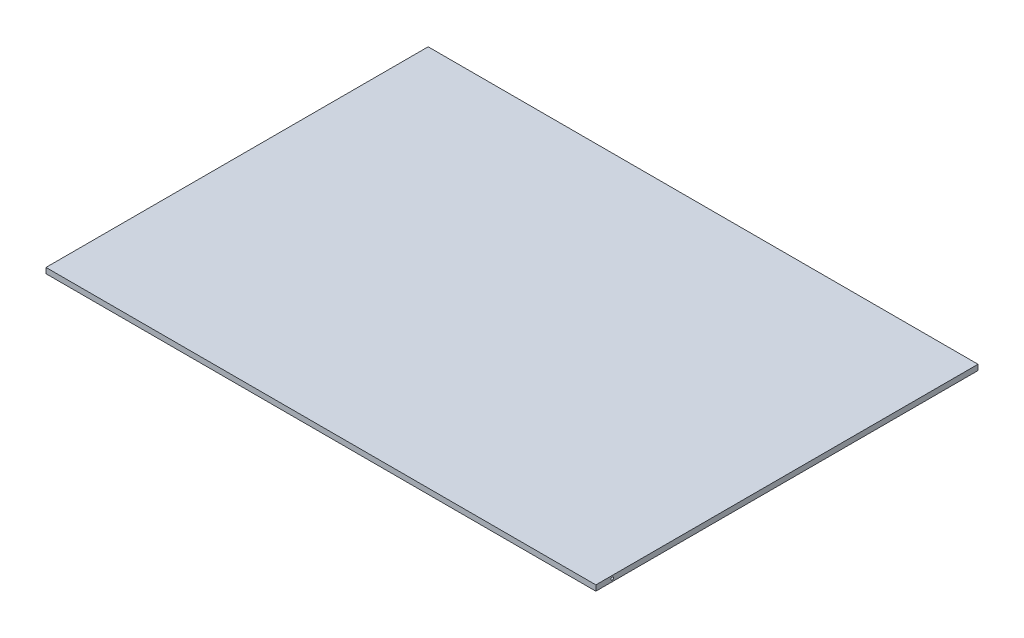
ISO-10303-21;
HEADER;
FILE_DESCRIPTION(('STEP AP214'),'2;1');
FILE_NAME('part.step','',(''),(''),'','','');
FILE_SCHEMA(('AUTOMOTIVE_DESIGN { 1 0 10303 214 1 1 1 1 }'));
ENDSEC;
DATA;
#1=APPLICATION_CONTEXT('core data for automotive mechanical design processes');
#2=APPLICATION_PROTOCOL_DEFINITION('international standard','automotive_design',2000,#1);
#3=PRODUCT_CONTEXT('',#1,'mechanical');
#4=PRODUCT('Part','Part','',(#3));
#5=PRODUCT_RELATED_PRODUCT_CATEGORY('part','',(#4));
#6=PRODUCT_DEFINITION_FORMATION('','',#4);
#7=PRODUCT_DEFINITION_CONTEXT('part definition',#1,'design');
#8=PRODUCT_DEFINITION('design','',#6,#7);
#9=PRODUCT_DEFINITION_SHAPE('','',#8);
#10=(LENGTH_UNIT() NAMED_UNIT(*) SI_UNIT(.MILLI.,.METRE.));
#11=(NAMED_UNIT(*) PLANE_ANGLE_UNIT() SI_UNIT($,.RADIAN.));
#12=(NAMED_UNIT(*) SI_UNIT($,.STERADIAN.) SOLID_ANGLE_UNIT());
#13=UNCERTAINTY_MEASURE_WITH_UNIT(LENGTH_MEASURE(1.E-05),#10,'distance_accuracy_value','');
#14=(GEOMETRIC_REPRESENTATION_CONTEXT(3) GLOBAL_UNCERTAINTY_ASSIGNED_CONTEXT((#13)) GLOBAL_UNIT_ASSIGNED_CONTEXT((#10,
#11,#12)) REPRESENTATION_CONTEXT('',''));
#15=CARTESIAN_POINT('',(0.,0.,0.));
#16=DIRECTION('',(0.,0.,1.));
#17=DIRECTION('',(1.,0.,0.));
#18=AXIS2_PLACEMENT_3D('',#15,#16,#17);
#19=CARTESIAN_POINT('',(-100.,2.,67.));
#20=DIRECTION('',(1.,0.,0.));
#21=DIRECTION('',(0.,0.,-1.));
#22=AXIS2_PLACEMENT_3D('',#19,#20,#21);
#23=PLANE('',#22);
#24=CARTESIAN_POINT('',(-100.,1.,66.));
#25=DIRECTION('',(1.,0.,0.));
#26=DIRECTION('',(0.,0.,-1.));
#27=AXIS2_PLACEMENT_3D('',#24,#25,#26);
#28=CIRCLE('',#27,0.499999999999999);
#29=CARTESIAN_POINT('',(-100.,1.,65.5));
#30=VERTEX_POINT('',#29);
#31=EDGE_CURVE('E88',#30,#30,#28,.T.);
#32=ORIENTED_EDGE('',*,*,#31,.T.);
#33=EDGE_LOOP('',(#32));
#34=FACE_BOUND('',#33,.T.);
#35=DIRECTION('',(0.,0.,1.));
#36=VECTOR('',#35,1.);
#37=CARTESIAN_POINT('',(-100.,0.,67.));
#38=LINE('',#37,#36);
#39=CARTESIAN_POINT('',(-100.,0.,-67.));
#40=VERTEX_POINT('',#39);
#41=CARTESIAN_POINT('',(-100.,0.,72.));
#42=VERTEX_POINT('',#41);
#43=EDGE_CURVE('E82',#40,#42,#38,.T.);
#44=ORIENTED_EDGE('',*,*,#43,.T.);
#45=DIRECTION('',(0.,-1.,0.));
#46=VECTOR('',#45,1.);
#47=CARTESIAN_POINT('',(-100.,0.,72.));
#48=LINE('',#47,#46);
#49=CARTESIAN_POINT('',(-100.,2.,72.));
#50=VERTEX_POINT('',#49);
#51=EDGE_CURVE('E85',#50,#42,#48,.T.);
#52=ORIENTED_EDGE('',*,*,#51,.F.);
#53=DIRECTION('',(0.,0.,1.));
#54=VECTOR('',#53,1.);
#55=CARTESIAN_POINT('',(-100.,2.,67.));
#56=LINE('',#55,#54);
#57=CARTESIAN_POINT('',(-100.,2.,-67.));
#58=VERTEX_POINT('',#57);
#59=EDGE_CURVE('E69',#58,#50,#56,.T.);
#60=ORIENTED_EDGE('',*,*,#59,.F.);
#61=DIRECTION('',(0.,-1.,0.));
#62=VECTOR('',#61,1.);
#63=CARTESIAN_POINT('',(-100.,2.,-67.));
#64=LINE('',#63,#62);
#65=EDGE_CURVE('E45',#58,#40,#64,.T.);
#66=ORIENTED_EDGE('',*,*,#65,.T.);
#67=EDGE_LOOP('',(#44,#52,#60,#66));
#68=FACE_BOUND('',#67,.T.);
#69=ADVANCED_FACE('F37',(#34,#68),#23,.F.);
#70=CARTESIAN_POINT('',(100.,2.,67.));
#71=DIRECTION('',(-1.,0.,0.));
#72=DIRECTION('',(0.,0.,1.));
#73=AXIS2_PLACEMENT_3D('',#70,#71,#72);
#74=PLANE('',#73);
#75=CARTESIAN_POINT('',(100.,1.,66.));
#76=DIRECTION('',(1.,0.,0.));
#77=DIRECTION('',(0.,0.,-1.));
#78=AXIS2_PLACEMENT_3D('',#75,#76,#77);
#79=CIRCLE('',#78,0.499999999999999);
#80=CARTESIAN_POINT('',(100.,1.,65.5));
#81=VERTEX_POINT('',#80);
#82=EDGE_CURVE('E103',#81,#81,#79,.T.);
#83=ORIENTED_EDGE('',*,*,#82,.F.);
#84=EDGE_LOOP('',(#83));
#85=FACE_BOUND('',#84,.T.);
#86=DIRECTION('',(0.,0.,-1.));
#87=VECTOR('',#86,1.);
#88=CARTESIAN_POINT('',(100.,0.,67.));
#89=LINE('',#88,#87);
#90=CARTESIAN_POINT('',(100.,0.,72.));
#91=VERTEX_POINT('',#90);
#92=CARTESIAN_POINT('',(100.,0.,-67.));
#93=VERTEX_POINT('',#92);
#94=EDGE_CURVE('E64',#91,#93,#89,.T.);
#95=ORIENTED_EDGE('',*,*,#94,.T.);
#96=DIRECTION('',(0.,-1.,0.));
#97=VECTOR('',#96,1.);
#98=CARTESIAN_POINT('',(100.,2.,-67.));
#99=LINE('',#98,#97);
#100=CARTESIAN_POINT('',(100.,2.,-67.));
#101=VERTEX_POINT('',#100);
#102=EDGE_CURVE('E11',#101,#93,#99,.T.);
#103=ORIENTED_EDGE('',*,*,#102,.F.);
#104=DIRECTION('',(0.,0.,-1.));
#105=VECTOR('',#104,1.);
#106=CARTESIAN_POINT('',(100.,2.,67.));
#107=LINE('',#106,#105);
#108=CARTESIAN_POINT('',(100.,2.,72.));
#109=VERTEX_POINT('',#108);
#110=EDGE_CURVE('E109',#109,#101,#107,.T.);
#111=ORIENTED_EDGE('',*,*,#110,.F.);
#112=DIRECTION('',(0.,1.,0.));
#113=VECTOR('',#112,1.);
#114=CARTESIAN_POINT('',(100.,0.,72.));
#115=LINE('',#114,#113);
#116=EDGE_CURVE('E95',#91,#109,#115,.T.);
#117=ORIENTED_EDGE('',*,*,#116,.F.);
#118=EDGE_LOOP('',(#95,#103,#111,#117));
#119=FACE_BOUND('',#118,.T.);
#120=ADVANCED_FACE('F116',(#85,#119),#74,.F.);
#121=CARTESIAN_POINT('',(100.,2.,-67.));
#122=DIRECTION('',(0.,0.,1.));
#123=DIRECTION('',(1.,0.,0.));
#124=AXIS2_PLACEMENT_3D('',#121,#122,#123);
#125=PLANE('',#124);
#126=DIRECTION('',(-1.,0.,0.));
#127=VECTOR('',#126,1.);
#128=CARTESIAN_POINT('',(100.,0.,-67.));
#129=LINE('',#128,#127);
#130=EDGE_CURVE('E110',#93,#40,#129,.T.);
#131=ORIENTED_EDGE('',*,*,#130,.T.);
#132=ORIENTED_EDGE('',*,*,#65,.F.);
#133=DIRECTION('',(-1.,0.,0.));
#134=VECTOR('',#133,1.);
#135=CARTESIAN_POINT('',(100.,2.,-67.));
#136=LINE('',#135,#134);
#137=EDGE_CURVE('E53',#101,#58,#136,.T.);
#138=ORIENTED_EDGE('',*,*,#137,.F.);
#139=ORIENTED_EDGE('',*,*,#102,.T.);
#140=EDGE_LOOP('',(#131,#132,#138,#139));
#141=FACE_BOUND('',#140,.T.);
#142=ADVANCED_FACE('F115',(#141),#125,.F.);
#143=CARTESIAN_POINT('',(0.,2.,0.));
#144=DIRECTION('',(0.,1.,0.));
#145=DIRECTION('',(0.,0.,1.));
#146=AXIS2_PLACEMENT_3D('',#143,#144,#145);
#147=PLANE('',#146);
#148=ORIENTED_EDGE('',*,*,#59,.T.);
#149=DIRECTION('',(-1.,0.,0.));
#150=VECTOR('',#149,1.);
#151=CARTESIAN_POINT('',(-100.,2.,72.));
#152=LINE('',#151,#150);
#153=EDGE_CURVE('E98',#109,#50,#152,.T.);
#154=ORIENTED_EDGE('',*,*,#153,.F.);
#155=ORIENTED_EDGE('',*,*,#110,.T.);
#156=ORIENTED_EDGE('',*,*,#137,.T.);
#157=EDGE_LOOP('',(#148,#154,#155,#156));
#158=FACE_BOUND('',#157,.T.);
#159=ADVANCED_FACE('F117',(#158),#147,.T.);
#160=CARTESIAN_POINT('',(0.,0.,0.));
#161=DIRECTION('',(0.,1.,0.));
#162=DIRECTION('',(0.,0.,1.));
#163=AXIS2_PLACEMENT_3D('',#160,#161,#162);
#164=PLANE('',#163);
#165=ORIENTED_EDGE('',*,*,#43,.F.);
#166=ORIENTED_EDGE('',*,*,#130,.F.);
#167=ORIENTED_EDGE('',*,*,#94,.F.);
#168=DIRECTION('',(1.,0.,0.));
#169=VECTOR('',#168,1.);
#170=CARTESIAN_POINT('',(-100.,0.,72.));
#171=LINE('',#170,#169);
#172=EDGE_CURVE('E91',#42,#91,#171,.T.);
#173=ORIENTED_EDGE('',*,*,#172,.F.);
#174=EDGE_LOOP('',(#165,#166,#167,#173));
#175=FACE_BOUND('',#174,.T.);
#176=ADVANCED_FACE('F92',(#175),#164,.F.);
#177=CARTESIAN_POINT('',(-100.,1.,66.));
#178=DIRECTION('',(1.,0.,0.));
#179=DIRECTION('',(0.,0.,-1.));
#180=AXIS2_PLACEMENT_3D('',#177,#178,#179);
#181=CYLINDRICAL_SURFACE('',#180,0.499999999999999);
#182=ORIENTED_EDGE('',*,*,#31,.F.);
#183=EDGE_LOOP('',(#182));
#184=FACE_BOUND('',#183,.T.);
#185=ORIENTED_EDGE('',*,*,#82,.T.);
#186=EDGE_LOOP('',(#185));
#187=FACE_BOUND('',#186,.T.);
#188=ADVANCED_FACE('F124',(#184,#187),#181,.F.);
#189=CARTESIAN_POINT('',(0.,0.,72.));
#190=DIRECTION('',(0.,0.,-1.));
#191=DIRECTION('',(-1.,0.,0.));
#192=AXIS2_PLACEMENT_3D('',#189,#190,#191);
#193=PLANE('',#192);
#194=ORIENTED_EDGE('',*,*,#51,.T.);
#195=ORIENTED_EDGE('',*,*,#172,.T.);
#196=ORIENTED_EDGE('',*,*,#116,.T.);
#197=ORIENTED_EDGE('',*,*,#153,.T.);
#198=EDGE_LOOP('',(#194,#195,#196,#197));
#199=FACE_BOUND('',#198,.T.);
#200=ADVANCED_FACE('F97',(#199),#193,.F.);
#201=CLOSED_SHELL('',(#69,#120,#142,#159,#176,#188,#200));
#202=MANIFOLD_SOLID_BREP('B2',#201);
#203=ADVANCED_BREP_SHAPE_REPRESENTATION('',(#18,#202),#14);
#204=SHAPE_DEFINITION_REPRESENTATION(#9,#203);
ENDSEC;
END-ISO-10303-21;
